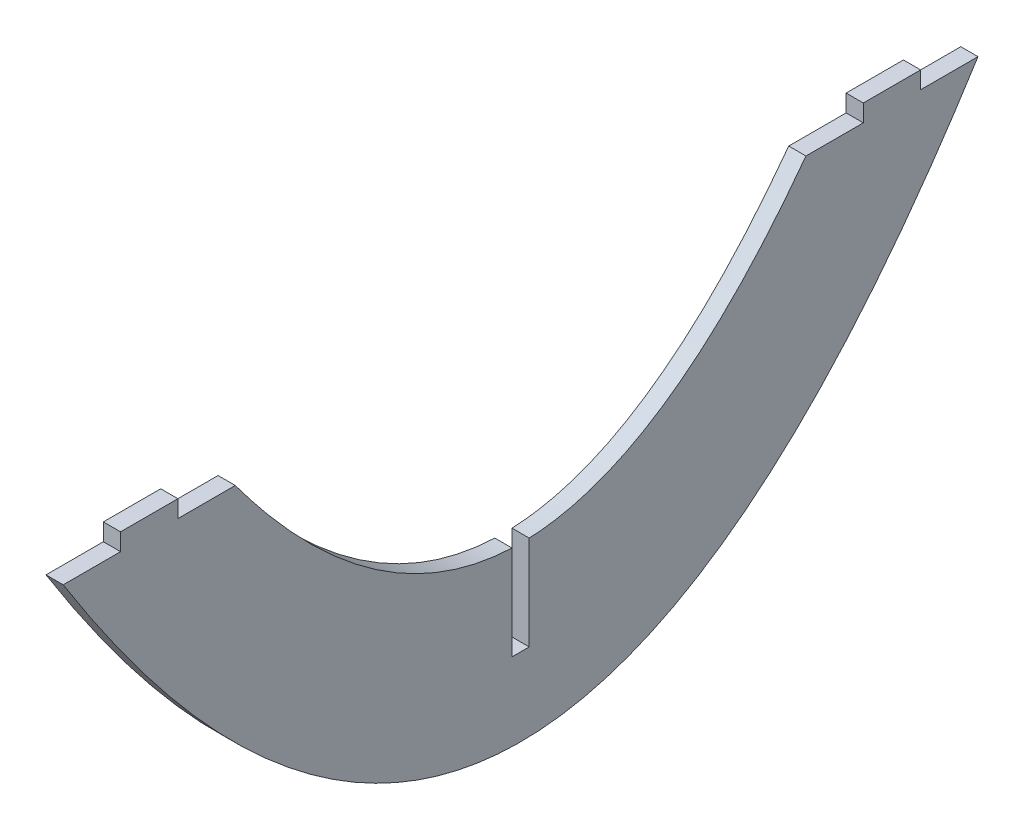
ISO-10303-21;
HEADER;
FILE_DESCRIPTION(('STEP AP214'),'2;1');
FILE_NAME('part.step','',(''),(''),'','','');
FILE_SCHEMA(('AUTOMOTIVE_DESIGN { 1 0 10303 214 1 1 1 1 }'));
ENDSEC;
DATA;
#1=APPLICATION_CONTEXT('core data for automotive mechanical design processes');
#2=APPLICATION_PROTOCOL_DEFINITION('international standard','automotive_design',2000,#1);
#3=PRODUCT_CONTEXT('',#1,'mechanical');
#4=PRODUCT('Part','Part','',(#3));
#5=PRODUCT_RELATED_PRODUCT_CATEGORY('part','',(#4));
#6=PRODUCT_DEFINITION_FORMATION('','',#4);
#7=PRODUCT_DEFINITION_CONTEXT('part definition',#1,'design');
#8=PRODUCT_DEFINITION('design','',#6,#7);
#9=PRODUCT_DEFINITION_SHAPE('','',#8);
#10=(LENGTH_UNIT() NAMED_UNIT(*) SI_UNIT(.MILLI.,.METRE.));
#11=(NAMED_UNIT(*) PLANE_ANGLE_UNIT() SI_UNIT($,.RADIAN.));
#12=(NAMED_UNIT(*) SI_UNIT($,.STERADIAN.) SOLID_ANGLE_UNIT());
#13=UNCERTAINTY_MEASURE_WITH_UNIT(LENGTH_MEASURE(1.E-05),#10,'distance_accuracy_value','');
#14=(GEOMETRIC_REPRESENTATION_CONTEXT(3) GLOBAL_UNCERTAINTY_ASSIGNED_CONTEXT((#13)) GLOBAL_UNIT_ASSIGNED_CONTEXT((#10,
#11,#12)) REPRESENTATION_CONTEXT('',''));
#15=CARTESIAN_POINT('',(0.,0.,0.));
#16=DIRECTION('',(0.,0.,1.));
#17=DIRECTION('',(1.,0.,0.));
#18=AXIS2_PLACEMENT_3D('',#15,#16,#17);
#19=CARTESIAN_POINT('',(3.,150.000523308042,-49.7510941737334));
#20=CARTESIAN_POINT('',(3.,82.7970166919614,-2.617697725249E-12));
#21=CARTESIAN_POINT('',(3.,150.000523308035,49.7510941737282));
#22=B_SPLINE_CURVE_WITH_KNOTS('',2,(#19,#20,#21),.UNSPECIFIED.,.F.,.F.,(3,3),(0.22233668522419,
0.777663314775839),.UNSPECIFIED.);
#23=DIRECTION('',(-1.,0.,0.));
#24=VECTOR('',#23,1.);
#25=SURFACE_OF_LINEAR_EXTRUSION('',#22,#24);
#26=DIRECTION('',(-1.,0.,0.));
#27=VECTOR('',#26,1.);
#28=CARTESIAN_POINT('',(3.,116.4293149335,-1.49999999999198));
#29=LINE('',#28,#27);
#30=CARTESIAN_POINT('',(3.,116.4293149335,-1.49999999999198));
#31=VERTEX_POINT('',#30);
#32=CARTESIAN_POINT('',(0.,116.4293149335,-1.49999999999198));
#33=VERTEX_POINT('',#32);
#34=EDGE_CURVE('E182',#31,#33,#29,.T.);
#35=ORIENTED_EDGE('',*,*,#34,.F.);
#36=CARTESIAN_POINT('',(3.,150.000523308035,-49.7510941737282));
#37=VERTEX_POINT('',#36);
#38=EDGE_CURVE('E236',#37,#31,#22,.T.);
#39=ORIENTED_EDGE('',*,*,#38,.F.);
#40=DIRECTION('',(-1.,0.,0.));
#41=VECTOR('',#40,1.);
#42=CARTESIAN_POINT('',(3.,150.000523308035,-49.7510941737282));
#43=LINE('',#42,#41);
#44=CARTESIAN_POINT('',(0.,150.000523308035,-49.7510941737282));
#45=VERTEX_POINT('',#44);
#46=EDGE_CURVE('E296',#37,#45,#43,.T.);
#47=ORIENTED_EDGE('',*,*,#46,.T.);
#48=CARTESIAN_POINT('',(0.,150.000523308042,-49.7510941737334));
#49=CARTESIAN_POINT('',(0.,82.7970166919614,-2.617697725249E-12));
#50=CARTESIAN_POINT('',(0.,150.000523308035,49.7510941737282));
#51=B_SPLINE_CURVE_WITH_KNOTS('',2,(#48,#49,#50),.UNSPECIFIED.,.F.,.F.,(3,3),(0.22233668522419,
0.777663314775839),.UNSPECIFIED.);
#52=EDGE_CURVE('E291',#45,#33,#51,.T.);
#53=ORIENTED_EDGE('',*,*,#52,.T.);
#54=EDGE_LOOP('',(#35,#39,#47,#53));
#55=FACE_BOUND('',#54,.T.);
#56=ADVANCED_FACE('F37',(#55),#25,.F.);
#57=CARTESIAN_POINT('',(3.,116.39877,-2.62984078958084E-12));
#58=DIRECTION('',(-1.,0.,0.));
#59=DIRECTION('',(0.,0.,1.));
#60=AXIS2_PLACEMENT_3D('',#57,#58,#59);
#61=PLANE('',#60);
#62=DIRECTION('',(0.,1.,0.));
#63=VECTOR('',#62,1.);
#64=CARTESIAN_POINT('',(3.,0.,-1.49999999999195));
#65=LINE('',#64,#63);
#66=CARTESIAN_POINT('',(3.,99.9903638168229,-1.49999999999195));
#67=VERTEX_POINT('',#66);
#68=EDGE_CURVE('E159',#67,#31,#65,.T.);
#69=ORIENTED_EDGE('',*,*,#68,.F.);
#70=DIRECTION('',(0.,0.,1.));
#71=VECTOR('',#70,1.);
#72=CARTESIAN_POINT('',(3.,99.9903638168229,0.));
#73=LINE('',#72,#71);
#74=CARTESIAN_POINT('',(3.,99.9903638168229,1.50000000000805));
#75=VERTEX_POINT('',#74);
#76=EDGE_CURVE('E154',#67,#75,#73,.T.);
#77=ORIENTED_EDGE('',*,*,#76,.T.);
#78=DIRECTION('',(0.,1.,0.));
#79=VECTOR('',#78,1.);
#80=CARTESIAN_POINT('',(3.,0.,1.50000000000805));
#81=LINE('',#80,#79);
#82=CARTESIAN_POINT('',(3.,116.4293149335,1.50000000000805));
#83=VERTEX_POINT('',#82);
#84=EDGE_CURVE('E162',#75,#83,#81,.T.);
#85=ORIENTED_EDGE('',*,*,#84,.T.);
#86=CARTESIAN_POINT('',(3.,150.000523308036,49.7510941737287));
#87=VERTEX_POINT('',#86);
#88=EDGE_CURVE('E242',#83,#87,#22,.T.);
#89=ORIENTED_EDGE('',*,*,#88,.T.);
#90=DIRECTION('',(0.,0.,1.));
#91=VECTOR('',#90,1.);
#92=CARTESIAN_POINT('',(3.,150.000523308036,79.7507074000873));
#93=LINE('',#92,#91);
#94=CARTESIAN_POINT('',(3.,150.000523308036,59.7509007869272));
#95=VERTEX_POINT('',#94);
#96=EDGE_CURVE('E243',#87,#95,#93,.T.);
#97=ORIENTED_EDGE('',*,*,#96,.T.);
#98=DIRECTION('',(0.,-1.,0.));
#99=VECTOR('',#98,1.);
#100=CARTESIAN_POINT('',(3.,153.000523308036,59.7509007869272));
#101=LINE('',#100,#99);
#102=CARTESIAN_POINT('',(3.,153.000523308036,59.7509007869272));
#103=VERTEX_POINT('',#102);
#104=EDGE_CURVE('E221',#103,#95,#101,.T.);
#105=ORIENTED_EDGE('',*,*,#104,.F.);
#106=DIRECTION('',(0.,0.,-1.));
#107=VECTOR('',#106,1.);
#108=CARTESIAN_POINT('',(3.,153.000523308036,0.));
#109=LINE('',#108,#107);
#110=CARTESIAN_POINT('',(3.,153.000523308036,69.7509007868881));
#111=VERTEX_POINT('',#110);
#112=EDGE_CURVE('E219',#111,#103,#109,.T.);
#113=ORIENTED_EDGE('',*,*,#112,.F.);
#114=DIRECTION('',(0.,-1.,0.));
#115=VECTOR('',#114,1.);
#116=CARTESIAN_POINT('',(3.,153.000523308036,69.7509007868881));
#117=LINE('',#116,#115);
#118=CARTESIAN_POINT('',(3.,150.000523308036,69.7509007868881));
#119=VERTEX_POINT('',#118);
#120=EDGE_CURVE('E227',#111,#119,#117,.T.);
#121=ORIENTED_EDGE('',*,*,#120,.T.);
#122=CARTESIAN_POINT('',(3.,150.000523308036,79.7507074000873));
#123=VERTEX_POINT('',#122);
#124=EDGE_CURVE('E241',#119,#123,#93,.T.);
#125=ORIENTED_EDGE('',*,*,#124,.T.);
#126=CARTESIAN_POINT('',(3.,150.0005233081,79.7507074000686));
#127=CARTESIAN_POINT('',(3.,22.797016691942,2.69203062619461E-11));
#128=CARTESIAN_POINT('',(3.,150.000523308016,-79.7507074000147));
#129=B_SPLINE_CURVE_WITH_KNOTS('',2,(#126,#127,#128),.UNSPECIFIED.,.F.,.F.,(3,3),
(0.0595498146292896,0.940450185370413),.UNSPECIFIED.);
#130=CARTESIAN_POINT('',(3.,150.000523308016,-79.7507074000147));
#131=VERTEX_POINT('',#130);
#132=EDGE_CURVE('E249',#123,#131,#129,.T.);
#133=ORIENTED_EDGE('',*,*,#132,.T.);
#134=DIRECTION('',(0.,0.,1.));
#135=VECTOR('',#134,1.);
#136=CARTESIAN_POINT('',(3.,150.000523308035,-49.7510941737282));
#137=LINE('',#136,#135);
#138=CARTESIAN_POINT('',(3.,150.000523308035,-69.7509007868715));
#139=VERTEX_POINT('',#138);
#140=EDGE_CURVE('E254',#131,#139,#137,.T.);
#141=ORIENTED_EDGE('',*,*,#140,.T.);
#142=DIRECTION('',(0.,-1.,0.));
#143=VECTOR('',#142,1.);
#144=CARTESIAN_POINT('',(3.,153.000523308036,-69.7509007868715));
#145=LINE('',#144,#143);
#146=CARTESIAN_POINT('',(3.,153.000523308036,-69.7509007868715));
#147=VERTEX_POINT('',#146);
#148=EDGE_CURVE('E196',#147,#139,#145,.T.);
#149=ORIENTED_EDGE('',*,*,#148,.F.);
#150=DIRECTION('',(0.,0.,-1.));
#151=VECTOR('',#150,1.);
#152=CARTESIAN_POINT('',(3.,153.000523308036,0.));
#153=LINE('',#152,#151);
#154=CARTESIAN_POINT('',(3.,153.000523308036,-59.7509007868715));
#155=VERTEX_POINT('',#154);
#156=EDGE_CURVE('E194',#155,#147,#153,.T.);
#157=ORIENTED_EDGE('',*,*,#156,.F.);
#158=DIRECTION('',(0.,-1.,0.));
#159=VECTOR('',#158,1.);
#160=CARTESIAN_POINT('',(3.,153.000523308036,-59.7509007868715));
#161=LINE('',#160,#159);
#162=CARTESIAN_POINT('',(3.,150.000523308035,-59.7509007868715));
#163=VERTEX_POINT('',#162);
#164=EDGE_CURVE('E201',#155,#163,#161,.T.);
#165=ORIENTED_EDGE('',*,*,#164,.T.);
#166=EDGE_CURVE('E61',#163,#37,#137,.T.);
#167=ORIENTED_EDGE('',*,*,#166,.T.);
#168=ORIENTED_EDGE('',*,*,#38,.T.);
#169=EDGE_LOOP('',(#69,#77,#85,#89,#97,#105,#113,#121,#125,#133,#141,#149,#157,#165,#167,#168));
#170=FACE_BOUND('',#169,.T.);
#171=ADVANCED_FACE('F168',(#170),#61,.F.);
#172=CARTESIAN_POINT('',(0.,116.39877,-2.62984078958084E-12));
#173=DIRECTION('',(-1.,0.,0.));
#174=DIRECTION('',(0.,0.,1.));
#175=AXIS2_PLACEMENT_3D('',#172,#173,#174);
#176=PLANE('',#175);
#177=DIRECTION('',(0.,0.,1.));
#178=VECTOR('',#177,1.);
#179=CARTESIAN_POINT('',(0.,99.9903638168229,0.));
#180=LINE('',#179,#178);
#181=CARTESIAN_POINT('',(0.,99.9903638168229,-1.49999999999195));
#182=VERTEX_POINT('',#181);
#183=CARTESIAN_POINT('',(0.,99.9903638168229,1.50000000000805));
#184=VERTEX_POINT('',#183);
#185=EDGE_CURVE('E53',#182,#184,#180,.T.);
#186=ORIENTED_EDGE('',*,*,#185,.F.);
#187=DIRECTION('',(0.,1.,0.));
#188=VECTOR('',#187,1.);
#189=CARTESIAN_POINT('',(0.,0.,-1.49999999999195));
#190=LINE('',#189,#188);
#191=EDGE_CURVE('E170',#182,#33,#190,.T.);
#192=ORIENTED_EDGE('',*,*,#191,.T.);
#193=ORIENTED_EDGE('',*,*,#52,.F.);
#194=DIRECTION('',(0.,0.,1.));
#195=VECTOR('',#194,1.);
#196=CARTESIAN_POINT('',(0.,150.000523308035,-49.7510941737282));
#197=LINE('',#196,#195);
#198=CARTESIAN_POINT('',(0.,150.000523308036,-59.7509007868715));
#199=VERTEX_POINT('',#198);
#200=EDGE_CURVE('E297',#199,#45,#197,.T.);
#201=ORIENTED_EDGE('',*,*,#200,.F.);
#202=DIRECTION('',(0.,-1.,0.));
#203=VECTOR('',#202,1.);
#204=CARTESIAN_POINT('',(0.,153.000523308036,-59.7509007868715));
#205=LINE('',#204,#203);
#206=CARTESIAN_POINT('',(0.,153.000523308036,-59.7509007868715));
#207=VERTEX_POINT('',#206);
#208=EDGE_CURVE('E204',#207,#199,#205,.T.);
#209=ORIENTED_EDGE('',*,*,#208,.F.);
#210=DIRECTION('',(0.,0.,-1.));
#211=VECTOR('',#210,1.);
#212=CARTESIAN_POINT('',(0.,153.000523308036,0.));
#213=LINE('',#212,#211);
#214=CARTESIAN_POINT('',(0.,153.000523308036,-69.7509007868715));
#215=VERTEX_POINT('',#214);
#216=EDGE_CURVE('E188',#207,#215,#213,.T.);
#217=ORIENTED_EDGE('',*,*,#216,.T.);
#218=DIRECTION('',(0.,-1.,0.));
#219=VECTOR('',#218,1.);
#220=CARTESIAN_POINT('',(0.,153.000523308036,-69.7509007868715));
#221=LINE('',#220,#219);
#222=CARTESIAN_POINT('',(0.,150.000523308035,-69.7509007868715));
#223=VERTEX_POINT('',#222);
#224=EDGE_CURVE('E207',#215,#223,#221,.T.);
#225=ORIENTED_EDGE('',*,*,#224,.T.);
#226=CARTESIAN_POINT('',(0.,150.000523308016,-79.7507074000147));
#227=VERTEX_POINT('',#226);
#228=EDGE_CURVE('E304',#227,#223,#197,.T.);
#229=ORIENTED_EDGE('',*,*,#228,.F.);
#230=CARTESIAN_POINT('',(0.,150.0005233081,79.7507074000686));
#231=CARTESIAN_POINT('',(0.,22.797016691942,2.69203062619461E-11));
#232=CARTESIAN_POINT('',(0.,150.000523308016,-79.7507074000147));
#233=B_SPLINE_CURVE_WITH_KNOTS('',2,(#230,#231,#232),.UNSPECIFIED.,.F.,.F.,(3,3),
(0.0595498146292896,0.940450185370413),.UNSPECIFIED.);
#234=CARTESIAN_POINT('',(0.,150.000523308036,79.7507074000873));
#235=VERTEX_POINT('',#234);
#236=EDGE_CURVE('E311',#235,#227,#233,.T.);
#237=ORIENTED_EDGE('',*,*,#236,.F.);
#238=DIRECTION('',(0.,0.,1.));
#239=VECTOR('',#238,1.);
#240=CARTESIAN_POINT('',(0.,150.000523308036,79.7507074000873));
#241=LINE('',#240,#239);
#242=CARTESIAN_POINT('',(0.,150.000523308036,69.7509007868881));
#243=VERTEX_POINT('',#242);
#244=EDGE_CURVE('E315',#243,#235,#241,.T.);
#245=ORIENTED_EDGE('',*,*,#244,.F.);
#246=DIRECTION('',(0.,-1.,0.));
#247=VECTOR('',#246,1.);
#248=CARTESIAN_POINT('',(0.,153.000523308036,69.7509007868881));
#249=LINE('',#248,#247);
#250=CARTESIAN_POINT('',(0.,153.000523308036,69.7509007868881));
#251=VERTEX_POINT('',#250);
#252=EDGE_CURVE('E230',#251,#243,#249,.T.);
#253=ORIENTED_EDGE('',*,*,#252,.F.);
#254=DIRECTION('',(0.,0.,1.));
#255=VECTOR('',#254,1.);
#256=CARTESIAN_POINT('',(0.,153.000523308036,0.));
#257=LINE('',#256,#255);
#258=CARTESIAN_POINT('',(0.,153.000523308036,59.7509007869272));
#259=VERTEX_POINT('',#258);
#260=EDGE_CURVE('E214',#259,#251,#257,.T.);
#261=ORIENTED_EDGE('',*,*,#260,.F.);
#262=DIRECTION('',(0.,-1.,0.));
#263=VECTOR('',#262,1.);
#264=CARTESIAN_POINT('',(0.,153.000523308036,59.7509007869272));
#265=LINE('',#264,#263);
#266=CARTESIAN_POINT('',(0.,150.000523308036,59.7509007869272));
#267=VERTEX_POINT('',#266);
#268=EDGE_CURVE('E233',#259,#267,#265,.T.);
#269=ORIENTED_EDGE('',*,*,#268,.T.);
#270=CARTESIAN_POINT('',(0.,150.000523308036,49.7510941737287));
#271=VERTEX_POINT('',#270);
#272=EDGE_CURVE('E317',#271,#267,#241,.T.);
#273=ORIENTED_EDGE('',*,*,#272,.F.);
#274=CARTESIAN_POINT('',(0.,116.4293149335,1.50000000000805));
#275=VERTEX_POINT('',#274);
#276=EDGE_CURVE('E235',#275,#271,#51,.T.);
#277=ORIENTED_EDGE('',*,*,#276,.F.);
#278=DIRECTION('',(0.,1.,0.));
#279=VECTOR('',#278,1.);
#280=CARTESIAN_POINT('',(0.,0.,1.50000000000805));
#281=LINE('',#280,#279);
#282=EDGE_CURVE('E173',#184,#275,#281,.T.);
#283=ORIENTED_EDGE('',*,*,#282,.F.);
#284=EDGE_LOOP('',(#186,#192,#193,#201,#209,#217,#225,#229,#237,#245,#253,#261,#269,#273,#277,#283));
#285=FACE_BOUND('',#284,.T.);
#286=ADVANCED_FACE('F284',(#285),#176,.T.);
#287=CARTESIAN_POINT('',(3.,150.000523308035,-49.7510941737282));
#288=DIRECTION('',(0.,-1.,0.));
#289=DIRECTION('',(0.,0.,-1.));
#290=AXIS2_PLACEMENT_3D('',#287,#288,#289);
#291=PLANE('',#290);
#292=DIRECTION('',(1.,0.,0.));
#293=VECTOR('',#292,1.);
#294=CARTESIAN_POINT('',(0.,150.000523308036,-59.7509007868715));
#295=LINE('',#294,#293);
#296=EDGE_CURVE('E189',#199,#163,#295,.T.);
#297=ORIENTED_EDGE('',*,*,#296,.F.);
#298=ORIENTED_EDGE('',*,*,#200,.T.);
#299=ORIENTED_EDGE('',*,*,#46,.F.);
#300=ORIENTED_EDGE('',*,*,#166,.F.);
#301=EDGE_LOOP('',(#297,#298,#299,#300));
#302=FACE_BOUND('',#301,.T.);
#303=ADVANCED_FACE('F276',(#302),#291,.F.);
#304=CARTESIAN_POINT('',(3.,150.000523308036,79.7507074000873));
#305=DIRECTION('',(0.,-1.,0.));
#306=DIRECTION('',(0.,0.,-1.));
#307=AXIS2_PLACEMENT_3D('',#304,#305,#306);
#308=PLANE('',#307);
#309=DIRECTION('',(1.,0.,0.));
#310=VECTOR('',#309,1.);
#311=CARTESIAN_POINT('',(0.,150.000523308036,69.7509007868881));
#312=LINE('',#311,#310);
#313=EDGE_CURVE('E215',#243,#119,#312,.T.);
#314=ORIENTED_EDGE('',*,*,#313,.F.);
#315=ORIENTED_EDGE('',*,*,#244,.T.);
#316=DIRECTION('',(-1.,0.,0.));
#317=VECTOR('',#316,1.);
#318=CARTESIAN_POINT('',(3.,150.000523308036,79.7507074000873));
#319=LINE('',#318,#317);
#320=EDGE_CURVE('E46',#123,#235,#319,.T.);
#321=ORIENTED_EDGE('',*,*,#320,.F.);
#322=ORIENTED_EDGE('',*,*,#124,.F.);
#323=EDGE_LOOP('',(#314,#315,#321,#322));
#324=FACE_BOUND('',#323,.T.);
#325=ADVANCED_FACE('F269',(#324),#308,.F.);
#326=ORIENTED_EDGE('',*,*,#88,.F.);
#327=DIRECTION('',(-1.,0.,0.));
#328=VECTOR('',#327,1.);
#329=CARTESIAN_POINT('',(3.,116.4293149335,1.50000000000805));
#330=LINE('',#329,#328);
#331=EDGE_CURVE('E158',#83,#275,#330,.T.);
#332=ORIENTED_EDGE('',*,*,#331,.T.);
#333=ORIENTED_EDGE('',*,*,#276,.T.);
#334=DIRECTION('',(-1.,0.,0.));
#335=VECTOR('',#334,1.);
#336=CARTESIAN_POINT('',(3.,150.000523308036,49.7510941737287));
#337=LINE('',#336,#335);
#338=EDGE_CURVE('E11',#87,#271,#337,.T.);
#339=ORIENTED_EDGE('',*,*,#338,.F.);
#340=EDGE_LOOP('',(#326,#332,#333,#339));
#341=FACE_BOUND('',#340,.T.);
#342=ADVANCED_FACE('F39',(#341),#25,.F.);
#343=ORIENTED_EDGE('',*,*,#272,.T.);
#344=DIRECTION('',(1.,0.,0.));
#345=VECTOR('',#344,1.);
#346=CARTESIAN_POINT('',(0.,150.000523308036,59.7509007869272));
#347=LINE('',#346,#345);
#348=EDGE_CURVE('E210',#267,#95,#347,.T.);
#349=ORIENTED_EDGE('',*,*,#348,.T.);
#350=ORIENTED_EDGE('',*,*,#96,.F.);
#351=ORIENTED_EDGE('',*,*,#338,.T.);
#352=EDGE_LOOP('',(#343,#349,#350,#351));
#353=FACE_BOUND('',#352,.T.);
#354=ADVANCED_FACE('F264',(#353),#308,.F.);
#355=DIRECTION('',(-1.,0.,0.));
#356=VECTOR('',#355,1.);
#357=SURFACE_OF_LINEAR_EXTRUSION('',#129,#356);
#358=ORIENTED_EDGE('',*,*,#236,.T.);
#359=DIRECTION('',(-1.,0.,0.));
#360=VECTOR('',#359,1.);
#361=CARTESIAN_POINT('',(3.,150.000523308016,-79.7507074000147));
#362=LINE('',#361,#360);
#363=EDGE_CURVE('E298',#131,#227,#362,.T.);
#364=ORIENTED_EDGE('',*,*,#363,.F.);
#365=ORIENTED_EDGE('',*,*,#132,.F.);
#366=ORIENTED_EDGE('',*,*,#320,.T.);
#367=EDGE_LOOP('',(#358,#364,#365,#366));
#368=FACE_BOUND('',#367,.T.);
#369=ADVANCED_FACE('F260',(#368),#357,.F.);
#370=ORIENTED_EDGE('',*,*,#228,.T.);
#371=DIRECTION('',(1.,0.,0.));
#372=VECTOR('',#371,1.);
#373=CARTESIAN_POINT('',(0.,150.000523308036,-69.7509007868715));
#374=LINE('',#373,#372);
#375=EDGE_CURVE('E181',#223,#139,#374,.T.);
#376=ORIENTED_EDGE('',*,*,#375,.T.);
#377=ORIENTED_EDGE('',*,*,#140,.F.);
#378=ORIENTED_EDGE('',*,*,#363,.T.);
#379=EDGE_LOOP('',(#370,#376,#377,#378));
#380=FACE_BOUND('',#379,.T.);
#381=ADVANCED_FACE('F263',(#380),#291,.F.);
#382=CARTESIAN_POINT('',(0.,153.000523308036,59.7509007869272));
#383=DIRECTION('',(0.,0.,-1.));
#384=DIRECTION('',(-1.,0.,0.));
#385=AXIS2_PLACEMENT_3D('',#382,#383,#384);
#386=PLANE('',#385);
#387=ORIENTED_EDGE('',*,*,#348,.F.);
#388=ORIENTED_EDGE('',*,*,#268,.F.);
#389=DIRECTION('',(1.,0.,0.));
#390=VECTOR('',#389,1.);
#391=CARTESIAN_POINT('',(0.,153.000523308036,59.7509007869272));
#392=LINE('',#391,#390);
#393=EDGE_CURVE('E211',#259,#103,#392,.T.);
#394=ORIENTED_EDGE('',*,*,#393,.T.);
#395=ORIENTED_EDGE('',*,*,#104,.T.);
#396=EDGE_LOOP('',(#387,#388,#394,#395));
#397=FACE_BOUND('',#396,.T.);
#398=ADVANCED_FACE('F338',(#397),#386,.T.);
#399=CARTESIAN_POINT('',(0.,153.000523308036,69.7509007868881));
#400=DIRECTION('',(0.,0.,-1.));
#401=DIRECTION('',(-1.,0.,0.));
#402=AXIS2_PLACEMENT_3D('',#399,#400,#401);
#403=PLANE('',#402);
#404=ORIENTED_EDGE('',*,*,#313,.T.);
#405=ORIENTED_EDGE('',*,*,#120,.F.);
#406=DIRECTION('',(1.,0.,0.));
#407=VECTOR('',#406,1.);
#408=CARTESIAN_POINT('',(0.,153.000523308036,69.7509007868881));
#409=LINE('',#408,#407);
#410=EDGE_CURVE('E217',#251,#111,#409,.T.);
#411=ORIENTED_EDGE('',*,*,#410,.F.);
#412=ORIENTED_EDGE('',*,*,#252,.T.);
#413=EDGE_LOOP('',(#404,#405,#411,#412));
#414=FACE_BOUND('',#413,.T.);
#415=ADVANCED_FACE('F345',(#414),#403,.F.);
#416=CARTESIAN_POINT('',(0.,153.000523308036,0.));
#417=DIRECTION('',(0.,1.,0.));
#418=DIRECTION('',(0.,0.,1.));
#419=AXIS2_PLACEMENT_3D('',#416,#417,#418);
#420=PLANE('',#419);
#421=ORIENTED_EDGE('',*,*,#393,.F.);
#422=ORIENTED_EDGE('',*,*,#260,.T.);
#423=ORIENTED_EDGE('',*,*,#410,.T.);
#424=ORIENTED_EDGE('',*,*,#112,.T.);
#425=EDGE_LOOP('',(#421,#422,#423,#424));
#426=FACE_BOUND('',#425,.T.);
#427=ADVANCED_FACE('F341',(#426),#420,.T.);
#428=CARTESIAN_POINT('',(0.,153.000523308036,-69.7509007868715));
#429=DIRECTION('',(0.,0.,-1.));
#430=DIRECTION('',(-1.,0.,0.));
#431=AXIS2_PLACEMENT_3D('',#428,#429,#430);
#432=PLANE('',#431);
#433=ORIENTED_EDGE('',*,*,#375,.F.);
#434=ORIENTED_EDGE('',*,*,#224,.F.);
#435=DIRECTION('',(1.,0.,0.));
#436=VECTOR('',#435,1.);
#437=CARTESIAN_POINT('',(0.,153.000523308036,-69.7509007868715));
#438=LINE('',#437,#436);
#439=EDGE_CURVE('E185',#215,#147,#438,.T.);
#440=ORIENTED_EDGE('',*,*,#439,.T.);
#441=ORIENTED_EDGE('',*,*,#148,.T.);
#442=EDGE_LOOP('',(#433,#434,#440,#441));
#443=FACE_BOUND('',#442,.T.);
#444=ADVANCED_FACE('F352',(#443),#432,.T.);
#445=CARTESIAN_POINT('',(0.,153.000523308036,-59.7509007868715));
#446=DIRECTION('',(0.,0.,-1.));
#447=DIRECTION('',(-1.,0.,0.));
#448=AXIS2_PLACEMENT_3D('',#445,#446,#447);
#449=PLANE('',#448);
#450=ORIENTED_EDGE('',*,*,#296,.T.);
#451=ORIENTED_EDGE('',*,*,#164,.F.);
#452=DIRECTION('',(1.,0.,0.));
#453=VECTOR('',#452,1.);
#454=CARTESIAN_POINT('',(0.,153.000523308036,-59.7509007868715));
#455=LINE('',#454,#453);
#456=EDGE_CURVE('E192',#207,#155,#455,.T.);
#457=ORIENTED_EDGE('',*,*,#456,.F.);
#458=ORIENTED_EDGE('',*,*,#208,.T.);
#459=EDGE_LOOP('',(#450,#451,#457,#458));
#460=FACE_BOUND('',#459,.T.);
#461=ADVANCED_FACE('F376',(#460),#449,.F.);
#462=CARTESIAN_POINT('',(0.,153.000523308036,0.));
#463=DIRECTION('',(0.,1.,0.));
#464=DIRECTION('',(0.,0.,1.));
#465=AXIS2_PLACEMENT_3D('',#462,#463,#464);
#466=PLANE('',#465);
#467=ORIENTED_EDGE('',*,*,#439,.F.);
#468=ORIENTED_EDGE('',*,*,#216,.F.);
#469=ORIENTED_EDGE('',*,*,#456,.T.);
#470=ORIENTED_EDGE('',*,*,#156,.T.);
#471=EDGE_LOOP('',(#467,#468,#469,#470));
#472=FACE_BOUND('',#471,.T.);
#473=ADVANCED_FACE('F373',(#472),#466,.T.);
#474=CARTESIAN_POINT('',(3.,99.9903638168229,0.));
#475=DIRECTION('',(0.,-1.,0.));
#476=DIRECTION('',(0.,0.,-1.));
#477=AXIS2_PLACEMENT_3D('',#474,#475,#476);
#478=PLANE('',#477);
#479=ORIENTED_EDGE('',*,*,#185,.T.);
#480=DIRECTION('',(-1.,0.,0.));
#481=VECTOR('',#480,1.);
#482=CARTESIAN_POINT('',(3.,99.9903638168229,1.50000000000805));
#483=LINE('',#482,#481);
#484=EDGE_CURVE('E150',#75,#184,#483,.T.);
#485=ORIENTED_EDGE('',*,*,#484,.F.);
#486=ORIENTED_EDGE('',*,*,#76,.F.);
#487=DIRECTION('',(-1.,0.,0.));
#488=VECTOR('',#487,1.);
#489=CARTESIAN_POINT('',(3.,99.9903638168229,-1.49999999999195));
#490=LINE('',#489,#488);
#491=EDGE_CURVE('E179',#67,#182,#490,.T.);
#492=ORIENTED_EDGE('',*,*,#491,.T.);
#493=EDGE_LOOP('',(#479,#485,#486,#492));
#494=FACE_BOUND('',#493,.T.);
#495=ADVANCED_FACE('F152',(#494),#478,.F.);
#496=CARTESIAN_POINT('',(3.,0.,-1.49999999999195));
#497=DIRECTION('',(0.,0.,1.));
#498=DIRECTION('',(1.,0.,0.));
#499=AXIS2_PLACEMENT_3D('',#496,#497,#498);
#500=PLANE('',#499);
#501=ORIENTED_EDGE('',*,*,#191,.F.);
#502=ORIENTED_EDGE('',*,*,#491,.F.);
#503=ORIENTED_EDGE('',*,*,#68,.T.);
#504=ORIENTED_EDGE('',*,*,#34,.T.);
#505=EDGE_LOOP('',(#501,#502,#503,#504));
#506=FACE_BOUND('',#505,.T.);
#507=ADVANCED_FACE('F377',(#506),#500,.T.);
#508=CARTESIAN_POINT('',(3.,0.,1.50000000000805));
#509=DIRECTION('',(0.,0.,1.));
#510=DIRECTION('',(1.,0.,0.));
#511=AXIS2_PLACEMENT_3D('',#508,#509,#510);
#512=PLANE('',#511);
#513=ORIENTED_EDGE('',*,*,#282,.T.);
#514=ORIENTED_EDGE('',*,*,#331,.F.);
#515=ORIENTED_EDGE('',*,*,#84,.F.);
#516=ORIENTED_EDGE('',*,*,#484,.T.);
#517=EDGE_LOOP('',(#513,#514,#515,#516));
#518=FACE_BOUND('',#517,.T.);
#519=ADVANCED_FACE('F163',(#518),#512,.F.);
#520=CLOSED_SHELL('',(#56,#171,#286,#303,#325,#342,#354,#369,#381,#398,#415,#427,#444,#461,#473,
#495,#507,#519));
#521=MANIFOLD_SOLID_BREP('B2',#520);
#522=ADVANCED_BREP_SHAPE_REPRESENTATION('',(#18,#521),#14);
#523=SHAPE_DEFINITION_REPRESENTATION(#9,#522);
ENDSEC;
END-ISO-10303-21;
